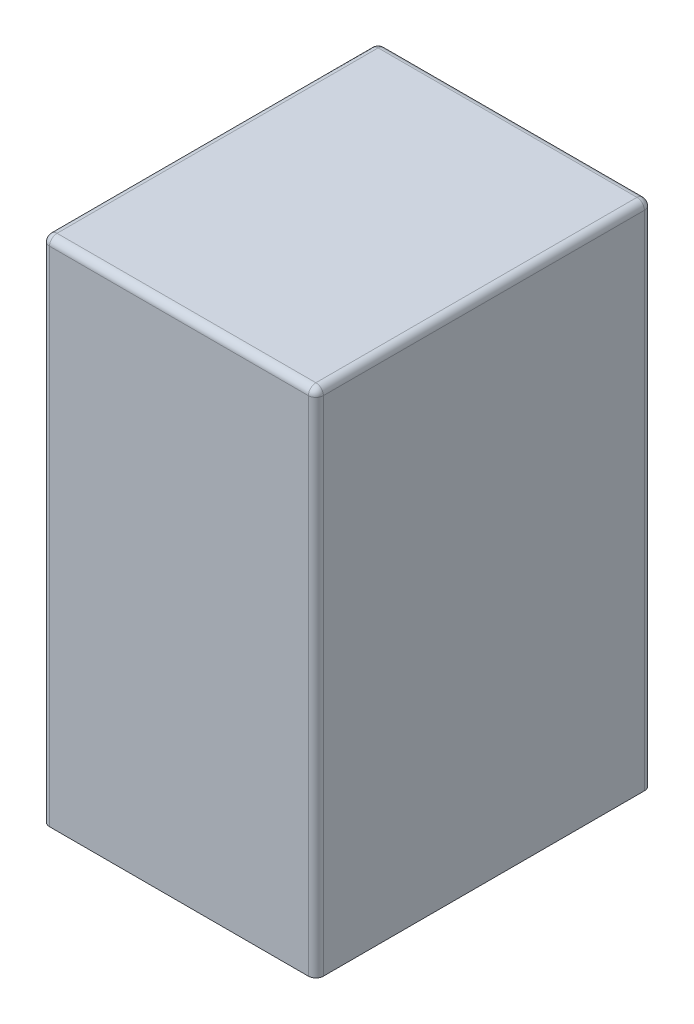
ISO-10303-21;
HEADER;
FILE_DESCRIPTION(('STEP AP214'),'2;1');
FILE_NAME('part.step','',(''),(''),'','','');
FILE_SCHEMA(('AUTOMOTIVE_DESIGN { 1 0 10303 214 1 1 1 1 }'));
ENDSEC;
DATA;
#1=APPLICATION_CONTEXT('core data for automotive mechanical design processes');
#2=APPLICATION_PROTOCOL_DEFINITION('international standard','automotive_design',2000,#1);
#3=PRODUCT_CONTEXT('',#1,'mechanical');
#4=PRODUCT('Part','Part','',(#3));
#5=PRODUCT_RELATED_PRODUCT_CATEGORY('part','',(#4));
#6=PRODUCT_DEFINITION_FORMATION('','',#4);
#7=PRODUCT_DEFINITION_CONTEXT('part definition',#1,'design');
#8=PRODUCT_DEFINITION('design','',#6,#7);
#9=PRODUCT_DEFINITION_SHAPE('','',#8);
#10=(LENGTH_UNIT() NAMED_UNIT(*) SI_UNIT(.MILLI.,.METRE.));
#11=(NAMED_UNIT(*) PLANE_ANGLE_UNIT() SI_UNIT($,.RADIAN.));
#12=(NAMED_UNIT(*) SI_UNIT($,.STERADIAN.) SOLID_ANGLE_UNIT());
#13=UNCERTAINTY_MEASURE_WITH_UNIT(LENGTH_MEASURE(1.E-05),#10,'distance_accuracy_value','');
#14=(GEOMETRIC_REPRESENTATION_CONTEXT(3) GLOBAL_UNCERTAINTY_ASSIGNED_CONTEXT((#13)) GLOBAL_UNIT_ASSIGNED_CONTEXT((#10,
#11,#12)) REPRESENTATION_CONTEXT('',''));
#15=CARTESIAN_POINT('',(0.,0.,0.));
#16=DIRECTION('',(0.,0.,1.));
#17=DIRECTION('',(1.,0.,0.));
#18=AXIS2_PLACEMENT_3D('',#15,#16,#17);
#19=CARTESIAN_POINT('',(0.,0.,0.));
#20=DIRECTION('',(0.,1.,0.));
#21=DIRECTION('',(0.,0.,1.));
#22=AXIS2_PLACEMENT_3D('',#19,#20,#21);
#23=PLANE('',#22);
#24=CARTESIAN_POINT('',(-52.5,0.,-65.));
#25=DIRECTION('',(0.,-1.,0.));
#26=DIRECTION('',(0.,0.,-1.));
#27=AXIS2_PLACEMENT_3D('',#24,#25,#26);
#28=CIRCLE('',#27,1.45);
#29=CARTESIAN_POINT('',(-52.5,0.,-66.45));
#30=VERTEX_POINT('',#29);
#31=EDGE_CURVE('E293',#30,#30,#28,.T.);
#32=ORIENTED_EDGE('',*,*,#31,.F.);
#33=EDGE_LOOP('',(#32));
#34=FACE_BOUND('',#33,.T.);
#35=CARTESIAN_POINT('',(-52.5,0.,0.));
#36=DIRECTION('',(0.,-1.,0.));
#37=DIRECTION('',(0.,0.,-1.));
#38=AXIS2_PLACEMENT_3D('',#35,#36,#37);
#39=CIRCLE('',#38,1.45);
#40=CARTESIAN_POINT('',(-52.5,0.,-1.45));
#41=VERTEX_POINT('',#40);
#42=EDGE_CURVE('E303',#41,#41,#39,.T.);
#43=ORIENTED_EDGE('',*,*,#42,.F.);
#44=EDGE_LOOP('',(#43));
#45=FACE_BOUND('',#44,.T.);
#46=CARTESIAN_POINT('',(-52.5,0.,65.));
#47=DIRECTION('',(0.,-1.,0.));
#48=DIRECTION('',(0.,0.,-1.));
#49=AXIS2_PLACEMENT_3D('',#46,#47,#48);
#50=CIRCLE('',#49,1.45);
#51=CARTESIAN_POINT('',(-52.5,0.,63.55));
#52=VERTEX_POINT('',#51);
#53=EDGE_CURVE('E775',#52,#52,#50,.T.);
#54=ORIENTED_EDGE('',*,*,#53,.F.);
#55=EDGE_LOOP('',(#54));
#56=FACE_BOUND('',#55,.T.);
#57=CARTESIAN_POINT('',(0.,0.,65.));
#58=DIRECTION('',(0.,-1.,0.));
#59=DIRECTION('',(0.,0.,-1.));
#60=AXIS2_PLACEMENT_3D('',#57,#58,#59);
#61=CIRCLE('',#60,1.45);
#62=CARTESIAN_POINT('',(0.,0.,63.55));
#63=VERTEX_POINT('',#62);
#64=EDGE_CURVE('E787',#63,#63,#61,.T.);
#65=ORIENTED_EDGE('',*,*,#64,.F.);
#66=EDGE_LOOP('',(#65));
#67=FACE_BOUND('',#66,.T.);
#68=CARTESIAN_POINT('',(52.5,0.,65.));
#69=DIRECTION('',(0.,-1.,0.));
#70=DIRECTION('',(0.,0.,-1.));
#71=AXIS2_PLACEMENT_3D('',#68,#69,#70);
#72=CIRCLE('',#71,1.45);
#73=CARTESIAN_POINT('',(52.5,0.,63.55));
#74=VERTEX_POINT('',#73);
#75=EDGE_CURVE('E795',#74,#74,#72,.T.);
#76=ORIENTED_EDGE('',*,*,#75,.F.);
#77=EDGE_LOOP('',(#76));
#78=FACE_BOUND('',#77,.T.);
#79=CARTESIAN_POINT('',(52.5,0.,0.));
#80=DIRECTION('',(0.,-1.,0.));
#81=DIRECTION('',(0.,0.,-1.));
#82=AXIS2_PLACEMENT_3D('',#79,#80,#81);
#83=CIRCLE('',#82,1.45);
#84=CARTESIAN_POINT('',(52.5,0.,-1.44999999999999));
#85=VERTEX_POINT('',#84);
#86=EDGE_CURVE('E803',#85,#85,#83,.T.);
#87=ORIENTED_EDGE('',*,*,#86,.F.);
#88=EDGE_LOOP('',(#87));
#89=FACE_BOUND('',#88,.T.);
#90=CARTESIAN_POINT('',(52.5,0.,-65.));
#91=DIRECTION('',(0.,-1.,0.));
#92=DIRECTION('',(0.,0.,-1.));
#93=AXIS2_PLACEMENT_3D('',#90,#91,#92);
#94=CIRCLE('',#93,1.45);
#95=CARTESIAN_POINT('',(52.5,0.,-66.45));
#96=VERTEX_POINT('',#95);
#97=EDGE_CURVE('E811',#96,#96,#94,.T.);
#98=ORIENTED_EDGE('',*,*,#97,.F.);
#99=EDGE_LOOP('',(#98));
#100=FACE_BOUND('',#99,.T.);
#101=CARTESIAN_POINT('',(0.,0.,-65.));
#102=DIRECTION('',(0.,-1.,0.));
#103=DIRECTION('',(0.,0.,-1.));
#104=AXIS2_PLACEMENT_3D('',#101,#102,#103);
#105=CIRCLE('',#104,1.45);
#106=CARTESIAN_POINT('',(0.,0.,-66.45));
#107=VERTEX_POINT('',#106);
#108=EDGE_CURVE('E312',#107,#107,#105,.T.);
#109=ORIENTED_EDGE('',*,*,#108,.F.);
#110=EDGE_LOOP('',(#109));
#111=FACE_BOUND('',#110,.T.);
#112=DIRECTION('',(0.,0.,1.));
#113=VECTOR('',#112,1.);
#114=CARTESIAN_POINT('',(-55.,0.,-67.5));
#115=LINE('',#114,#113);
#116=CARTESIAN_POINT('',(-55.,0.,-64.5));
#117=VERTEX_POINT('',#116);
#118=CARTESIAN_POINT('',(-55.,0.,64.5));
#119=VERTEX_POINT('',#118);
#120=EDGE_CURVE('E172',#117,#119,#115,.T.);
#121=ORIENTED_EDGE('',*,*,#120,.F.);
#122=CARTESIAN_POINT('',(-52.,0.,-64.5));
#123=DIRECTION('',(0.,1.,0.));
#124=DIRECTION('',(0.,0.,1.));
#125=AXIS2_PLACEMENT_3D('',#122,#123,#124);
#126=CIRCLE('',#125,3.);
#127=CARTESIAN_POINT('',(-52.,0.,-67.5));
#128=VERTEX_POINT('',#127);
#129=EDGE_CURVE('E11',#117,#128,#126,.F.);
#130=ORIENTED_EDGE('',*,*,#129,.T.);
#131=DIRECTION('',(-1.,0.,0.));
#132=VECTOR('',#131,1.);
#133=CARTESIAN_POINT('',(-55.,0.,-67.5));
#134=LINE('',#133,#132);
#135=CARTESIAN_POINT('',(52.,0.,-67.5));
#136=VERTEX_POINT('',#135);
#137=EDGE_CURVE('E189',#136,#128,#134,.T.);
#138=ORIENTED_EDGE('',*,*,#137,.F.);
#139=CARTESIAN_POINT('',(52.,0.,-64.5));
#140=DIRECTION('',(0.,1.,0.));
#141=DIRECTION('',(0.,0.,1.));
#142=AXIS2_PLACEMENT_3D('',#139,#140,#141);
#143=CIRCLE('',#142,3.);
#144=CARTESIAN_POINT('',(55.,0.,-64.5));
#145=VERTEX_POINT('',#144);
#146=EDGE_CURVE('E240',#136,#145,#143,.F.);
#147=ORIENTED_EDGE('',*,*,#146,.T.);
#148=DIRECTION('',(0.,0.,-1.));
#149=VECTOR('',#148,1.);
#150=CARTESIAN_POINT('',(55.,0.,-67.5));
#151=LINE('',#150,#149);
#152=CARTESIAN_POINT('',(55.,0.,64.5));
#153=VERTEX_POINT('',#152);
#154=EDGE_CURVE('E185',#153,#145,#151,.T.);
#155=ORIENTED_EDGE('',*,*,#154,.F.);
#156=CARTESIAN_POINT('',(52.,0.,64.5));
#157=DIRECTION('',(0.,1.,0.));
#158=DIRECTION('',(0.,0.,1.));
#159=AXIS2_PLACEMENT_3D('',#156,#157,#158);
#160=CIRCLE('',#159,3.);
#161=CARTESIAN_POINT('',(52.,0.,67.5));
#162=VERTEX_POINT('',#161);
#163=EDGE_CURVE('E243',#153,#162,#160,.F.);
#164=ORIENTED_EDGE('',*,*,#163,.T.);
#165=DIRECTION('',(1.,0.,0.));
#166=VECTOR('',#165,1.);
#167=CARTESIAN_POINT('',(-55.,0.,67.5));
#168=LINE('',#167,#166);
#169=CARTESIAN_POINT('',(-52.,0.,67.5));
#170=VERTEX_POINT('',#169);
#171=EDGE_CURVE('E181',#170,#162,#168,.T.);
#172=ORIENTED_EDGE('',*,*,#171,.F.);
#173=CARTESIAN_POINT('',(-52.,0.,64.5));
#174=DIRECTION('',(0.,1.,0.));
#175=DIRECTION('',(0.,0.,1.));
#176=AXIS2_PLACEMENT_3D('',#173,#174,#175);
#177=CIRCLE('',#176,3.);
#178=EDGE_CURVE('E49',#170,#119,#177,.F.);
#179=ORIENTED_EDGE('',*,*,#178,.T.);
#180=EDGE_LOOP('',(#121,#130,#138,#147,#155,#164,#172,#179));
#181=FACE_BOUND('',#180,.T.);
#182=DIRECTION('',(0.,0.,-1.));
#183=VECTOR('',#182,1.);
#184=CARTESIAN_POINT('',(50.,0.,-62.5));
#185=LINE('',#184,#183);
#186=CARTESIAN_POINT('',(50.,0.,62.5));
#187=VERTEX_POINT('',#186);
#188=CARTESIAN_POINT('',(50.,0.,-62.5));
#189=VERTEX_POINT('',#188);
#190=EDGE_CURVE('E311',#187,#189,#185,.T.);
#191=ORIENTED_EDGE('',*,*,#190,.T.);
#192=DIRECTION('',(-1.,0.,0.));
#193=VECTOR('',#192,1.);
#194=CARTESIAN_POINT('',(-50.,0.,-62.5));
#195=LINE('',#194,#193);
#196=CARTESIAN_POINT('',(-50.,0.,-62.5));
#197=VERTEX_POINT('',#196);
#198=EDGE_CURVE('E325',#189,#197,#195,.T.);
#199=ORIENTED_EDGE('',*,*,#198,.T.);
#200=DIRECTION('',(0.,0.,1.));
#201=VECTOR('',#200,1.);
#202=CARTESIAN_POINT('',(-50.,0.,-62.5));
#203=LINE('',#202,#201);
#204=CARTESIAN_POINT('',(-50.,0.,62.5));
#205=VERTEX_POINT('',#204);
#206=EDGE_CURVE('E165',#197,#205,#203,.T.);
#207=ORIENTED_EDGE('',*,*,#206,.T.);
#208=DIRECTION('',(1.,0.,0.));
#209=VECTOR('',#208,1.);
#210=CARTESIAN_POINT('',(-50.,0.,62.5));
#211=LINE('',#210,#209);
#212=EDGE_CURVE('E318',#205,#187,#211,.T.);
#213=ORIENTED_EDGE('',*,*,#212,.T.);
#214=EDGE_LOOP('',(#191,#199,#207,#213));
#215=FACE_BOUND('',#214,.T.);
#216=ADVANCED_FACE('F39',(#34,#45,#56,#67,#78,#89,#100,#111,#181,#215),#23,.F.);
#217=CARTESIAN_POINT('',(-55.,200.,-67.5));
#218=DIRECTION('',(1.,0.,0.));
#219=DIRECTION('',(0.,0.,-1.));
#220=AXIS2_PLACEMENT_3D('',#217,#218,#219);
#221=PLANE('',#220);
#222=DIRECTION('',(0.,0.,1.));
#223=VECTOR('',#222,1.);
#224=CARTESIAN_POINT('',(-55.,202.,-67.5));
#225=LINE('',#224,#223);
#226=CARTESIAN_POINT('',(-55.,202.,64.5));
#227=VERTEX_POINT('',#226);
#228=CARTESIAN_POINT('',(-55.,202.,-64.5));
#229=VERTEX_POINT('',#228);
#230=EDGE_CURVE('E227',#227,#229,#225,.F.);
#231=ORIENTED_EDGE('',*,*,#230,.T.);
#232=DIRECTION('',(0.,-1.,0.));
#233=VECTOR('',#232,1.);
#234=CARTESIAN_POINT('',(-55.,200.,-64.5));
#235=LINE('',#234,#233);
#236=EDGE_CURVE('E230',#229,#117,#235,.T.);
#237=ORIENTED_EDGE('',*,*,#236,.T.);
#238=ORIENTED_EDGE('',*,*,#120,.T.);
#239=DIRECTION('',(0.,-1.,0.));
#240=VECTOR('',#239,1.);
#241=CARTESIAN_POINT('',(-55.,200.,64.5));
#242=LINE('',#241,#240);
#243=EDGE_CURVE('E224',#119,#227,#242,.F.);
#244=ORIENTED_EDGE('',*,*,#243,.T.);
#245=EDGE_LOOP('',(#231,#237,#238,#244));
#246=FACE_BOUND('',#245,.T.);
#247=ADVANCED_FACE('F353',(#246),#221,.F.);
#248=CARTESIAN_POINT('',(-55.,200.,67.5));
#249=DIRECTION('',(0.,0.,-1.));
#250=DIRECTION('',(-1.,0.,0.));
#251=AXIS2_PLACEMENT_3D('',#248,#249,#250);
#252=PLANE('',#251);
#253=DIRECTION('',(1.,0.,0.));
#254=VECTOR('',#253,1.);
#255=CARTESIAN_POINT('',(-55.,202.,67.5));
#256=LINE('',#255,#254);
#257=CARTESIAN_POINT('',(52.,202.,67.5));
#258=VERTEX_POINT('',#257);
#259=CARTESIAN_POINT('',(-52.,202.,67.5));
#260=VERTEX_POINT('',#259);
#261=EDGE_CURVE('E218',#258,#260,#256,.F.);
#262=ORIENTED_EDGE('',*,*,#261,.T.);
#263=DIRECTION('',(0.,-1.,0.));
#264=VECTOR('',#263,1.);
#265=CARTESIAN_POINT('',(-52.,200.,67.5));
#266=LINE('',#265,#264);
#267=EDGE_CURVE('E221',#260,#170,#266,.T.);
#268=ORIENTED_EDGE('',*,*,#267,.T.);
#269=ORIENTED_EDGE('',*,*,#171,.T.);
#270=DIRECTION('',(0.,-1.,0.));
#271=VECTOR('',#270,1.);
#272=CARTESIAN_POINT('',(52.,200.,67.5));
#273=LINE('',#272,#271);
#274=EDGE_CURVE('E215',#162,#258,#273,.F.);
#275=ORIENTED_EDGE('',*,*,#274,.T.);
#276=EDGE_LOOP('',(#262,#268,#269,#275));
#277=FACE_BOUND('',#276,.T.);
#278=ADVANCED_FACE('F358',(#277),#252,.F.);
#279=CARTESIAN_POINT('',(55.,200.,-67.5));
#280=DIRECTION('',(-1.,0.,0.));
#281=DIRECTION('',(0.,0.,1.));
#282=AXIS2_PLACEMENT_3D('',#279,#280,#281);
#283=PLANE('',#282);
#284=DIRECTION('',(0.,0.,-1.));
#285=VECTOR('',#284,1.);
#286=CARTESIAN_POINT('',(55.,202.,67.5));
#287=LINE('',#286,#285);
#288=CARTESIAN_POINT('',(55.,202.,-64.5));
#289=VERTEX_POINT('',#288);
#290=CARTESIAN_POINT('',(55.,202.,64.5));
#291=VERTEX_POINT('',#290);
#292=EDGE_CURVE('E208',#289,#291,#287,.F.);
#293=ORIENTED_EDGE('',*,*,#292,.T.);
#294=DIRECTION('',(0.,-1.,0.));
#295=VECTOR('',#294,1.);
#296=CARTESIAN_POINT('',(55.,200.,64.5));
#297=LINE('',#296,#295);
#298=EDGE_CURVE('E212',#291,#153,#297,.T.);
#299=ORIENTED_EDGE('',*,*,#298,.T.);
#300=ORIENTED_EDGE('',*,*,#154,.T.);
#301=DIRECTION('',(0.,-1.,0.));
#302=VECTOR('',#301,1.);
#303=CARTESIAN_POINT('',(55.,200.,-64.5));
#304=LINE('',#303,#302);
#305=EDGE_CURVE('E205',#145,#289,#304,.F.);
#306=ORIENTED_EDGE('',*,*,#305,.T.);
#307=EDGE_LOOP('',(#293,#299,#300,#306));
#308=FACE_BOUND('',#307,.T.);
#309=ADVANCED_FACE('F349',(#308),#283,.F.);
#310=CARTESIAN_POINT('',(-55.,200.,-67.5));
#311=DIRECTION('',(0.,0.,1.));
#312=DIRECTION('',(1.,0.,0.));
#313=AXIS2_PLACEMENT_3D('',#310,#311,#312);
#314=PLANE('',#313);
#315=ORIENTED_EDGE('',*,*,#137,.T.);
#316=DIRECTION('',(0.,-1.,0.));
#317=VECTOR('',#316,1.);
#318=CARTESIAN_POINT('',(-52.,200.,-67.5));
#319=LINE('',#318,#317);
#320=CARTESIAN_POINT('',(-52.,202.,-67.5));
#321=VERTEX_POINT('',#320);
#322=EDGE_CURVE('E57',#128,#321,#319,.F.);
#323=ORIENTED_EDGE('',*,*,#322,.T.);
#324=DIRECTION('',(-1.,0.,0.));
#325=VECTOR('',#324,1.);
#326=CARTESIAN_POINT('',(55.,202.,-67.5));
#327=LINE('',#326,#325);
#328=CARTESIAN_POINT('',(52.,202.,-67.5));
#329=VERTEX_POINT('',#328);
#330=EDGE_CURVE('E62',#321,#329,#327,.F.);
#331=ORIENTED_EDGE('',*,*,#330,.T.);
#332=DIRECTION('',(0.,-1.,0.));
#333=VECTOR('',#332,1.);
#334=CARTESIAN_POINT('',(52.,200.,-67.5));
#335=LINE('',#334,#333);
#336=EDGE_CURVE('E233',#329,#136,#335,.T.);
#337=ORIENTED_EDGE('',*,*,#336,.T.);
#338=EDGE_LOOP('',(#315,#323,#331,#337));
#339=FACE_BOUND('',#338,.T.);
#340=ADVANCED_FACE('F342',(#339),#314,.F.);
#341=CARTESIAN_POINT('',(50.,200.,-62.5));
#342=DIRECTION('',(-1.,0.,0.));
#343=DIRECTION('',(0.,0.,1.));
#344=AXIS2_PLACEMENT_3D('',#341,#342,#343);
#345=PLANE('',#344);
#346=ORIENTED_EDGE('',*,*,#190,.F.);
#347=DIRECTION('',(0.,-1.,0.));
#348=VECTOR('',#347,1.);
#349=CARTESIAN_POINT('',(50.,200.,62.5));
#350=LINE('',#349,#348);
#351=CARTESIAN_POINT('',(50.,200.,62.5));
#352=VERTEX_POINT('',#351);
#353=EDGE_CURVE('E174',#352,#187,#350,.T.);
#354=ORIENTED_EDGE('',*,*,#353,.F.);
#355=DIRECTION('',(0.,0.,-1.));
#356=VECTOR('',#355,1.);
#357=CARTESIAN_POINT('',(50.,200.,-62.5));
#358=LINE('',#357,#356);
#359=CARTESIAN_POINT('',(50.,200.,-62.5));
#360=VERTEX_POINT('',#359);
#361=EDGE_CURVE('E161',#352,#360,#358,.T.);
#362=ORIENTED_EDGE('',*,*,#361,.T.);
#363=DIRECTION('',(0.,-1.,0.));
#364=VECTOR('',#363,1.);
#365=CARTESIAN_POINT('',(50.,200.,-62.5));
#366=LINE('',#365,#364);
#367=EDGE_CURVE('E159',#360,#189,#366,.T.);
#368=ORIENTED_EDGE('',*,*,#367,.T.);
#369=EDGE_LOOP('',(#346,#354,#362,#368));
#370=FACE_BOUND('',#369,.T.);
#371=ADVANCED_FACE('F340',(#370),#345,.T.);
#372=CARTESIAN_POINT('',(-50.,200.,-62.5));
#373=DIRECTION('',(0.,0.,1.));
#374=DIRECTION('',(1.,0.,0.));
#375=AXIS2_PLACEMENT_3D('',#372,#373,#374);
#376=PLANE('',#375);
#377=ORIENTED_EDGE('',*,*,#198,.F.);
#378=ORIENTED_EDGE('',*,*,#367,.F.);
#379=DIRECTION('',(-1.,0.,0.));
#380=VECTOR('',#379,1.);
#381=CARTESIAN_POINT('',(-50.,200.,-62.5));
#382=LINE('',#381,#380);
#383=CARTESIAN_POINT('',(-50.,200.,-62.5));
#384=VERTEX_POINT('',#383);
#385=EDGE_CURVE('E144',#360,#384,#382,.T.);
#386=ORIENTED_EDGE('',*,*,#385,.T.);
#387=DIRECTION('',(0.,-1.,0.));
#388=VECTOR('',#387,1.);
#389=CARTESIAN_POINT('',(-50.,200.,-62.5));
#390=LINE('',#389,#388);
#391=EDGE_CURVE('E156',#384,#197,#390,.T.);
#392=ORIENTED_EDGE('',*,*,#391,.T.);
#393=EDGE_LOOP('',(#377,#378,#386,#392));
#394=FACE_BOUND('',#393,.T.);
#395=ADVANCED_FACE('F155',(#394),#376,.T.);
#396=CARTESIAN_POINT('',(-50.,200.,-62.5));
#397=DIRECTION('',(1.,0.,0.));
#398=DIRECTION('',(0.,0.,-1.));
#399=AXIS2_PLACEMENT_3D('',#396,#397,#398);
#400=PLANE('',#399);
#401=ORIENTED_EDGE('',*,*,#206,.F.);
#402=ORIENTED_EDGE('',*,*,#391,.F.);
#403=DIRECTION('',(0.,0.,1.));
#404=VECTOR('',#403,1.);
#405=CARTESIAN_POINT('',(-50.,200.,-62.5));
#406=LINE('',#405,#404);
#407=CARTESIAN_POINT('',(-50.,200.,62.5));
#408=VERTEX_POINT('',#407);
#409=EDGE_CURVE('E141',#384,#408,#406,.T.);
#410=ORIENTED_EDGE('',*,*,#409,.T.);
#411=DIRECTION('',(0.,-1.,0.));
#412=VECTOR('',#411,1.);
#413=CARTESIAN_POINT('',(-50.,200.,62.5));
#414=LINE('',#413,#412);
#415=EDGE_CURVE('E168',#408,#205,#414,.T.);
#416=ORIENTED_EDGE('',*,*,#415,.T.);
#417=EDGE_LOOP('',(#401,#402,#410,#416));
#418=FACE_BOUND('',#417,.T.);
#419=ADVANCED_FACE('F163',(#418),#400,.T.);
#420=CARTESIAN_POINT('',(-50.,200.,62.5));
#421=DIRECTION('',(0.,0.,-1.));
#422=DIRECTION('',(-1.,0.,0.));
#423=AXIS2_PLACEMENT_3D('',#420,#421,#422);
#424=PLANE('',#423);
#425=ORIENTED_EDGE('',*,*,#212,.F.);
#426=ORIENTED_EDGE('',*,*,#415,.F.);
#427=DIRECTION('',(1.,0.,0.));
#428=VECTOR('',#427,1.);
#429=CARTESIAN_POINT('',(-50.,200.,62.5));
#430=LINE('',#429,#428);
#431=EDGE_CURVE('E147',#408,#352,#430,.T.);
#432=ORIENTED_EDGE('',*,*,#431,.T.);
#433=ORIENTED_EDGE('',*,*,#353,.T.);
#434=EDGE_LOOP('',(#425,#426,#432,#433));
#435=FACE_BOUND('',#434,.T.);
#436=ADVANCED_FACE('F337',(#435),#424,.T.);
#437=CARTESIAN_POINT('',(0.,200.,0.));
#438=DIRECTION('',(0.,1.,0.));
#439=DIRECTION('',(0.,0.,1.));
#440=AXIS2_PLACEMENT_3D('',#437,#438,#439);
#441=PLANE('',#440);
#442=ORIENTED_EDGE('',*,*,#385,.F.);
#443=ORIENTED_EDGE('',*,*,#361,.F.);
#444=ORIENTED_EDGE('',*,*,#431,.F.);
#445=ORIENTED_EDGE('',*,*,#409,.F.);
#446=EDGE_LOOP('',(#442,#443,#444,#445));
#447=FACE_BOUND('',#446,.T.);
#448=ADVANCED_FACE('F143',(#447),#441,.F.);
#449=CARTESIAN_POINT('',(0.,205.,0.));
#450=DIRECTION('',(0.,1.,0.));
#451=DIRECTION('',(0.,0.,1.));
#452=AXIS2_PLACEMENT_3D('',#449,#450,#451);
#453=PLANE('',#452);
#454=DIRECTION('',(1.,0.,0.));
#455=VECTOR('',#454,1.);
#456=CARTESIAN_POINT('',(55.,205.,64.5));
#457=LINE('',#456,#455);
#458=CARTESIAN_POINT('',(-52.,205.,64.5));
#459=VERTEX_POINT('',#458);
#460=CARTESIAN_POINT('',(52.,205.,64.5));
#461=VERTEX_POINT('',#460);
#462=EDGE_CURVE('E198',#459,#461,#457,.T.);
#463=ORIENTED_EDGE('',*,*,#462,.T.);
#464=DIRECTION('',(0.,0.,-1.));
#465=VECTOR('',#464,1.);
#466=CARTESIAN_POINT('',(52.,205.,-67.5));
#467=LINE('',#466,#465);
#468=CARTESIAN_POINT('',(52.,205.,-64.5));
#469=VERTEX_POINT('',#468);
#470=EDGE_CURVE('E201',#461,#469,#467,.T.);
#471=ORIENTED_EDGE('',*,*,#470,.T.);
#472=DIRECTION('',(-1.,0.,0.));
#473=VECTOR('',#472,1.);
#474=CARTESIAN_POINT('',(-55.,205.,-64.5));
#475=LINE('',#474,#473);
#476=CARTESIAN_POINT('',(-52.,205.,-64.5));
#477=VERTEX_POINT('',#476);
#478=EDGE_CURVE('E192',#469,#477,#475,.T.);
#479=ORIENTED_EDGE('',*,*,#478,.T.);
#480=DIRECTION('',(0.,0.,1.));
#481=VECTOR('',#480,1.);
#482=CARTESIAN_POINT('',(-52.,205.,67.5));
#483=LINE('',#482,#481);
#484=EDGE_CURVE('E195',#477,#459,#483,.T.);
#485=ORIENTED_EDGE('',*,*,#484,.T.);
#486=EDGE_LOOP('',(#463,#471,#479,#485));
#487=FACE_BOUND('',#486,.T.);
#488=ADVANCED_FACE('F440',(#487),#453,.T.);
#489=CARTESIAN_POINT('',(0.,12.,-65.));
#490=DIRECTION('',(0.,-1.,0.));
#491=DIRECTION('',(0.,0.,-1.));
#492=AXIS2_PLACEMENT_3D('',#489,#490,#491);
#493=CYLINDRICAL_SURFACE('',#492,1.45);
#494=CARTESIAN_POINT('',(0.,12.,-65.));
#495=DIRECTION('',(0.,-1.,0.));
#496=DIRECTION('',(0.,0.,-1.));
#497=AXIS2_PLACEMENT_3D('',#494,#495,#496);
#498=CIRCLE('',#497,1.45);
#499=CARTESIAN_POINT('',(0.,12.,-66.45));
#500=VERTEX_POINT('',#499);
#501=EDGE_CURVE('E307',#500,#500,#498,.T.);
#502=ORIENTED_EDGE('',*,*,#501,.F.);
#503=EDGE_LOOP('',(#502));
#504=FACE_BOUND('',#503,.T.);
#505=ORIENTED_EDGE('',*,*,#108,.T.);
#506=EDGE_LOOP('',(#505));
#507=FACE_BOUND('',#506,.T.);
#508=ADVANCED_FACE('F448',(#504,#507),#493,.F.);
#509=CARTESIAN_POINT('',(0.,12.,0.));
#510=DIRECTION('',(0.,-1.,0.));
#511=DIRECTION('',(0.,0.,-1.));
#512=AXIS2_PLACEMENT_3D('',#509,#510,#511);
#513=PLANE('',#512);
#514=ORIENTED_EDGE('',*,*,#501,.T.);
#515=EDGE_LOOP('',(#514));
#516=FACE_BOUND('',#515,.T.);
#517=ADVANCED_FACE('F454',(#516),#513,.T.);
#518=CARTESIAN_POINT('',(52.5,12.,-65.));
#519=DIRECTION('',(0.,-1.,0.));
#520=DIRECTION('',(0.,0.,-1.));
#521=AXIS2_PLACEMENT_3D('',#518,#519,#520);
#522=CYLINDRICAL_SURFACE('',#521,1.45);
#523=CARTESIAN_POINT('',(52.5,12.,-65.));
#524=DIRECTION('',(0.,-1.,0.));
#525=DIRECTION('',(0.,0.,-1.));
#526=AXIS2_PLACEMENT_3D('',#523,#524,#525);
#527=CIRCLE('',#526,1.45);
#528=CARTESIAN_POINT('',(52.5,12.,-66.45));
#529=VERTEX_POINT('',#528);
#530=EDGE_CURVE('E316',#529,#529,#527,.T.);
#531=ORIENTED_EDGE('',*,*,#530,.F.);
#532=EDGE_LOOP('',(#531));
#533=FACE_BOUND('',#532,.T.);
#534=ORIENTED_EDGE('',*,*,#97,.T.);
#535=EDGE_LOOP('',(#534));
#536=FACE_BOUND('',#535,.T.);
#537=ADVANCED_FACE('F493',(#533,#536),#522,.F.);
#538=CARTESIAN_POINT('',(0.,12.,0.));
#539=DIRECTION('',(0.,-1.,0.));
#540=DIRECTION('',(0.,0.,-1.));
#541=AXIS2_PLACEMENT_3D('',#538,#539,#540);
#542=PLANE('',#541);
#543=ORIENTED_EDGE('',*,*,#530,.T.);
#544=EDGE_LOOP('',(#543));
#545=FACE_BOUND('',#544,.T.);
#546=ADVANCED_FACE('F502',(#545),#542,.T.);
#547=CARTESIAN_POINT('',(52.5,12.,0.));
#548=DIRECTION('',(0.,-1.,0.));
#549=DIRECTION('',(0.,0.,-1.));
#550=AXIS2_PLACEMENT_3D('',#547,#548,#549);
#551=CYLINDRICAL_SURFACE('',#550,1.45);
#552=CARTESIAN_POINT('',(52.5,12.,0.));
#553=DIRECTION('',(0.,-1.,0.));
#554=DIRECTION('',(0.,0.,-1.));
#555=AXIS2_PLACEMENT_3D('',#552,#553,#554);
#556=CIRCLE('',#555,1.45);
#557=CARTESIAN_POINT('',(52.5,12.,-1.44999999999999));
#558=VERTEX_POINT('',#557);
#559=EDGE_CURVE('E807',#558,#558,#556,.T.);
#560=ORIENTED_EDGE('',*,*,#559,.F.);
#561=EDGE_LOOP('',(#560));
#562=FACE_BOUND('',#561,.T.);
#563=ORIENTED_EDGE('',*,*,#86,.T.);
#564=EDGE_LOOP('',(#563));
#565=FACE_BOUND('',#564,.T.);
#566=ADVANCED_FACE('F513',(#562,#565),#551,.F.);
#567=CARTESIAN_POINT('',(0.,12.,0.));
#568=DIRECTION('',(0.,-1.,0.));
#569=DIRECTION('',(0.,0.,-1.));
#570=AXIS2_PLACEMENT_3D('',#567,#568,#569);
#571=PLANE('',#570);
#572=ORIENTED_EDGE('',*,*,#559,.T.);
#573=EDGE_LOOP('',(#572));
#574=FACE_BOUND('',#573,.T.);
#575=ADVANCED_FACE('F523',(#574),#571,.T.);
#576=CARTESIAN_POINT('',(52.5,12.,65.));
#577=DIRECTION('',(0.,-1.,0.));
#578=DIRECTION('',(0.,0.,-1.));
#579=AXIS2_PLACEMENT_3D('',#576,#577,#578);
#580=CYLINDRICAL_SURFACE('',#579,1.45);
#581=CARTESIAN_POINT('',(52.5,12.,65.));
#582=DIRECTION('',(0.,-1.,0.));
#583=DIRECTION('',(0.,0.,-1.));
#584=AXIS2_PLACEMENT_3D('',#581,#582,#583);
#585=CIRCLE('',#584,1.45);
#586=CARTESIAN_POINT('',(52.5,12.,63.55));
#587=VERTEX_POINT('',#586);
#588=EDGE_CURVE('E799',#587,#587,#585,.T.);
#589=ORIENTED_EDGE('',*,*,#588,.F.);
#590=EDGE_LOOP('',(#589));
#591=FACE_BOUND('',#590,.T.);
#592=ORIENTED_EDGE('',*,*,#75,.T.);
#593=EDGE_LOOP('',(#592));
#594=FACE_BOUND('',#593,.T.);
#595=ADVANCED_FACE('F534',(#591,#594),#580,.F.);
#596=CARTESIAN_POINT('',(0.,12.,0.));
#597=DIRECTION('',(0.,-1.,0.));
#598=DIRECTION('',(0.,0.,-1.));
#599=AXIS2_PLACEMENT_3D('',#596,#597,#598);
#600=PLANE('',#599);
#601=ORIENTED_EDGE('',*,*,#588,.T.);
#602=EDGE_LOOP('',(#601));
#603=FACE_BOUND('',#602,.T.);
#604=ADVANCED_FACE('F544',(#603),#600,.T.);
#605=CARTESIAN_POINT('',(0.,12.,65.));
#606=DIRECTION('',(0.,-1.,0.));
#607=DIRECTION('',(0.,0.,-1.));
#608=AXIS2_PLACEMENT_3D('',#605,#606,#607);
#609=CYLINDRICAL_SURFACE('',#608,1.45);
#610=CARTESIAN_POINT('',(0.,12.,65.));
#611=DIRECTION('',(0.,-1.,0.));
#612=DIRECTION('',(0.,0.,-1.));
#613=AXIS2_PLACEMENT_3D('',#610,#611,#612);
#614=CIRCLE('',#613,1.45);
#615=CARTESIAN_POINT('',(0.,12.,63.55));
#616=VERTEX_POINT('',#615);
#617=EDGE_CURVE('E791',#616,#616,#614,.T.);
#618=ORIENTED_EDGE('',*,*,#617,.F.);
#619=EDGE_LOOP('',(#618));
#620=FACE_BOUND('',#619,.T.);
#621=ORIENTED_EDGE('',*,*,#64,.T.);
#622=EDGE_LOOP('',(#621));
#623=FACE_BOUND('',#622,.T.);
#624=ADVANCED_FACE('F555',(#620,#623),#609,.F.);
#625=CARTESIAN_POINT('',(0.,12.,0.));
#626=DIRECTION('',(0.,-1.,0.));
#627=DIRECTION('',(0.,0.,-1.));
#628=AXIS2_PLACEMENT_3D('',#625,#626,#627);
#629=PLANE('',#628);
#630=ORIENTED_EDGE('',*,*,#617,.T.);
#631=EDGE_LOOP('',(#630));
#632=FACE_BOUND('',#631,.T.);
#633=ADVANCED_FACE('F565',(#632),#629,.T.);
#634=CARTESIAN_POINT('',(-52.5,12.,65.));
#635=DIRECTION('',(0.,-1.,0.));
#636=DIRECTION('',(0.,0.,-1.));
#637=AXIS2_PLACEMENT_3D('',#634,#635,#636);
#638=CYLINDRICAL_SURFACE('',#637,1.45);
#639=CARTESIAN_POINT('',(-52.5,12.,65.));
#640=DIRECTION('',(0.,-1.,0.));
#641=DIRECTION('',(0.,0.,-1.));
#642=AXIS2_PLACEMENT_3D('',#639,#640,#641);
#643=CIRCLE('',#642,1.45);
#644=CARTESIAN_POINT('',(-52.5,12.,63.55));
#645=VERTEX_POINT('',#644);
#646=EDGE_CURVE('E780',#645,#645,#643,.T.);
#647=ORIENTED_EDGE('',*,*,#646,.F.);
#648=EDGE_LOOP('',(#647));
#649=FACE_BOUND('',#648,.T.);
#650=ORIENTED_EDGE('',*,*,#53,.T.);
#651=EDGE_LOOP('',(#650));
#652=FACE_BOUND('',#651,.T.);
#653=ADVANCED_FACE('F576',(#649,#652),#638,.F.);
#654=CARTESIAN_POINT('',(0.,12.,0.));
#655=DIRECTION('',(0.,-1.,0.));
#656=DIRECTION('',(0.,0.,-1.));
#657=AXIS2_PLACEMENT_3D('',#654,#655,#656);
#658=PLANE('',#657);
#659=ORIENTED_EDGE('',*,*,#646,.T.);
#660=EDGE_LOOP('',(#659));
#661=FACE_BOUND('',#660,.T.);
#662=ADVANCED_FACE('F586',(#661),#658,.T.);
#663=CARTESIAN_POINT('',(-52.5,12.,0.));
#664=DIRECTION('',(0.,-1.,0.));
#665=DIRECTION('',(0.,0.,-1.));
#666=AXIS2_PLACEMENT_3D('',#663,#664,#665);
#667=CYLINDRICAL_SURFACE('',#666,1.45);
#668=CARTESIAN_POINT('',(-52.5,12.,0.));
#669=DIRECTION('',(0.,-1.,0.));
#670=DIRECTION('',(0.,0.,-1.));
#671=AXIS2_PLACEMENT_3D('',#668,#669,#670);
#672=CIRCLE('',#671,1.45);
#673=CARTESIAN_POINT('',(-52.5,12.,-1.45));
#674=VERTEX_POINT('',#673);
#675=EDGE_CURVE('E773',#674,#674,#672,.T.);
#676=ORIENTED_EDGE('',*,*,#675,.F.);
#677=EDGE_LOOP('',(#676));
#678=FACE_BOUND('',#677,.T.);
#679=ORIENTED_EDGE('',*,*,#42,.T.);
#680=EDGE_LOOP('',(#679));
#681=FACE_BOUND('',#680,.T.);
#682=ADVANCED_FACE('F597',(#678,#681),#667,.F.);
#683=CARTESIAN_POINT('',(0.,12.,0.));
#684=DIRECTION('',(0.,-1.,0.));
#685=DIRECTION('',(0.,0.,-1.));
#686=AXIS2_PLACEMENT_3D('',#683,#684,#685);
#687=PLANE('',#686);
#688=ORIENTED_EDGE('',*,*,#675,.T.);
#689=EDGE_LOOP('',(#688));
#690=FACE_BOUND('',#689,.T.);
#691=ADVANCED_FACE('F607',(#690),#687,.T.);
#692=CARTESIAN_POINT('',(-52.5,12.,-65.));
#693=DIRECTION('',(0.,-1.,0.));
#694=DIRECTION('',(0.,0.,-1.));
#695=AXIS2_PLACEMENT_3D('',#692,#693,#694);
#696=CYLINDRICAL_SURFACE('',#695,1.45);
#697=CARTESIAN_POINT('',(-52.5,12.,-65.));
#698=DIRECTION('',(0.,-1.,0.));
#699=DIRECTION('',(0.,0.,-1.));
#700=AXIS2_PLACEMENT_3D('',#697,#698,#699);
#701=CIRCLE('',#700,1.45);
#702=CARTESIAN_POINT('',(-52.5,12.,-66.45));
#703=VERTEX_POINT('',#702);
#704=EDGE_CURVE('E297',#703,#703,#701,.T.);
#705=ORIENTED_EDGE('',*,*,#704,.F.);
#706=EDGE_LOOP('',(#705));
#707=FACE_BOUND('',#706,.T.);
#708=ORIENTED_EDGE('',*,*,#31,.T.);
#709=EDGE_LOOP('',(#708));
#710=FACE_BOUND('',#709,.T.);
#711=ADVANCED_FACE('F618',(#707,#710),#696,.F.);
#712=CARTESIAN_POINT('',(0.,12.,0.));
#713=DIRECTION('',(0.,-1.,0.));
#714=DIRECTION('',(0.,0.,-1.));
#715=AXIS2_PLACEMENT_3D('',#712,#713,#714);
#716=PLANE('',#715);
#717=ORIENTED_EDGE('',*,*,#704,.T.);
#718=EDGE_LOOP('',(#717));
#719=FACE_BOUND('',#718,.T.);
#720=ADVANCED_FACE('F413',(#719),#716,.T.);
#721=CARTESIAN_POINT('',(-52.,200.,64.5));
#722=DIRECTION('',(0.,-1.,0.));
#723=DIRECTION('',(0.,0.,-1.));
#724=AXIS2_PLACEMENT_3D('',#721,#722,#723);
#725=CYLINDRICAL_SURFACE('',#724,3.);
#726=ORIENTED_EDGE('',*,*,#178,.F.);
#727=ORIENTED_EDGE('',*,*,#267,.F.);
#728=CARTESIAN_POINT('',(-52.,202.,64.5));
#729=DIRECTION('',(0.,1.,0.));
#730=DIRECTION('',(0.,0.,1.));
#731=AXIS2_PLACEMENT_3D('',#728,#729,#730);
#732=CIRCLE('',#731,3.);
#733=EDGE_CURVE('E43',#227,#260,#732,.T.);
#734=ORIENTED_EDGE('',*,*,#733,.F.);
#735=ORIENTED_EDGE('',*,*,#243,.F.);
#736=EDGE_LOOP('',(#726,#727,#734,#735));
#737=FACE_BOUND('',#736,.T.);
#738=ADVANCED_FACE('F41',(#737),#725,.T.);
#739=CARTESIAN_POINT('',(-52.,202.,0.));
#740=DIRECTION('',(0.,0.,-1.));
#741=DIRECTION('',(-1.,0.,0.));
#742=AXIS2_PLACEMENT_3D('',#739,#740,#741);
#743=CYLINDRICAL_SURFACE('',#742,3.);
#744=CARTESIAN_POINT('',(-52.,202.,-64.5));
#745=DIRECTION('',(0.,0.,-1.));
#746=DIRECTION('',(-1.,0.,0.));
#747=AXIS2_PLACEMENT_3D('',#744,#745,#746);
#748=CIRCLE('',#747,3.);
#749=EDGE_CURVE('E282',#229,#477,#748,.T.);
#750=ORIENTED_EDGE('',*,*,#749,.F.);
#751=ORIENTED_EDGE('',*,*,#230,.F.);
#752=CARTESIAN_POINT('',(-52.,202.,64.5));
#753=DIRECTION('',(0.,0.,1.));
#754=DIRECTION('',(1.,0.,0.));
#755=AXIS2_PLACEMENT_3D('',#752,#753,#754);
#756=CIRCLE('',#755,3.);
#757=EDGE_CURVE('E285',#459,#227,#756,.T.);
#758=ORIENTED_EDGE('',*,*,#757,.F.);
#759=ORIENTED_EDGE('',*,*,#484,.F.);
#760=EDGE_LOOP('',(#750,#751,#758,#759));
#761=FACE_BOUND('',#760,.T.);
#762=ADVANCED_FACE('F406',(#761),#743,.T.);
#763=CARTESIAN_POINT('',(-52.,200.,-64.5));
#764=DIRECTION('',(0.,-1.,0.));
#765=DIRECTION('',(0.,0.,-1.));
#766=AXIS2_PLACEMENT_3D('',#763,#764,#765);
#767=CYLINDRICAL_SURFACE('',#766,3.);
#768=ORIENTED_EDGE('',*,*,#129,.F.);
#769=ORIENTED_EDGE('',*,*,#236,.F.);
#770=CARTESIAN_POINT('',(-52.,202.,-64.5));
#771=DIRECTION('',(0.,1.,0.));
#772=DIRECTION('',(0.,0.,1.));
#773=AXIS2_PLACEMENT_3D('',#770,#771,#772);
#774=CIRCLE('',#773,3.);
#775=EDGE_CURVE('E278',#321,#229,#774,.T.);
#776=ORIENTED_EDGE('',*,*,#775,.F.);
#777=ORIENTED_EDGE('',*,*,#322,.F.);
#778=EDGE_LOOP('',(#768,#769,#776,#777));
#779=FACE_BOUND('',#778,.T.);
#780=ADVANCED_FACE('F404',(#779),#767,.T.);
#781=CARTESIAN_POINT('',(-52.,202.,64.5));
#782=DIRECTION('',(-1.,0.,0.));
#783=DIRECTION('',(0.,0.,1.));
#784=AXIS2_PLACEMENT_3D('',#781,#782,#783);
#785=SPHERICAL_SURFACE('',#784,3.);
#786=ORIENTED_EDGE('',*,*,#757,.T.);
#787=ORIENTED_EDGE('',*,*,#733,.T.);
#788=CARTESIAN_POINT('',(-52.,202.,64.5));
#789=DIRECTION('',(-1.,0.,0.));
#790=DIRECTION('',(0.,0.,1.));
#791=AXIS2_PLACEMENT_3D('',#788,#789,#790);
#792=CIRCLE('',#791,3.);
#793=EDGE_CURVE('E274',#459,#260,#792,.F.);
#794=ORIENTED_EDGE('',*,*,#793,.F.);
#795=EDGE_LOOP('',(#786,#787,#794));
#796=FACE_BOUND('',#795,.T.);
#797=ADVANCED_FACE('F400',(#796),#785,.T.);
#798=CARTESIAN_POINT('',(-52.,202.,-64.5));
#799=DIRECTION('',(-1.,0.,0.));
#800=DIRECTION('',(0.,0.,1.));
#801=AXIS2_PLACEMENT_3D('',#798,#799,#800);
#802=SPHERICAL_SURFACE('',#801,3.);
#803=ORIENTED_EDGE('',*,*,#775,.T.);
#804=ORIENTED_EDGE('',*,*,#749,.T.);
#805=CARTESIAN_POINT('',(-52.,202.,-64.5));
#806=DIRECTION('',(-1.,0.,0.));
#807=DIRECTION('',(0.,0.,1.));
#808=AXIS2_PLACEMENT_3D('',#805,#806,#807);
#809=CIRCLE('',#808,3.);
#810=EDGE_CURVE('E270',#321,#477,#809,.F.);
#811=ORIENTED_EDGE('',*,*,#810,.F.);
#812=EDGE_LOOP('',(#803,#804,#811));
#813=FACE_BOUND('',#812,.T.);
#814=ADVANCED_FACE('F396',(#813),#802,.T.);
#815=CARTESIAN_POINT('',(52.,200.,64.5));
#816=DIRECTION('',(0.,-1.,0.));
#817=DIRECTION('',(0.,0.,-1.));
#818=AXIS2_PLACEMENT_3D('',#815,#816,#817);
#819=CYLINDRICAL_SURFACE('',#818,3.);
#820=ORIENTED_EDGE('',*,*,#163,.F.);
#821=ORIENTED_EDGE('',*,*,#298,.F.);
#822=CARTESIAN_POINT('',(52.,202.,64.5));
#823=DIRECTION('',(0.,1.,0.));
#824=DIRECTION('',(0.,0.,1.));
#825=AXIS2_PLACEMENT_3D('',#822,#823,#824);
#826=CIRCLE('',#825,3.);
#827=EDGE_CURVE('E266',#258,#291,#826,.T.);
#828=ORIENTED_EDGE('',*,*,#827,.F.);
#829=ORIENTED_EDGE('',*,*,#274,.F.);
#830=EDGE_LOOP('',(#820,#821,#828,#829));
#831=FACE_BOUND('',#830,.T.);
#832=ADVANCED_FACE('F392',(#831),#819,.T.);
#833=CARTESIAN_POINT('',(0.,202.,64.5));
#834=DIRECTION('',(-1.,0.,0.));
#835=DIRECTION('',(0.,0.,1.));
#836=AXIS2_PLACEMENT_3D('',#833,#834,#835);
#837=CYLINDRICAL_SURFACE('',#836,3.);
#838=ORIENTED_EDGE('',*,*,#793,.T.);
#839=ORIENTED_EDGE('',*,*,#261,.F.);
#840=CARTESIAN_POINT('',(52.,202.,64.5));
#841=DIRECTION('',(1.,0.,0.));
#842=DIRECTION('',(0.,0.,-1.));
#843=AXIS2_PLACEMENT_3D('',#840,#841,#842);
#844=CIRCLE('',#843,3.);
#845=EDGE_CURVE('E262',#461,#258,#844,.T.);
#846=ORIENTED_EDGE('',*,*,#845,.F.);
#847=ORIENTED_EDGE('',*,*,#462,.F.);
#848=EDGE_LOOP('',(#838,#839,#846,#847));
#849=FACE_BOUND('',#848,.T.);
#850=ADVANCED_FACE('F388',(#849),#837,.T.);
#851=CARTESIAN_POINT('',(0.,202.,-64.5));
#852=DIRECTION('',(1.,0.,0.));
#853=DIRECTION('',(0.,0.,-1.));
#854=AXIS2_PLACEMENT_3D('',#851,#852,#853);
#855=CYLINDRICAL_SURFACE('',#854,3.);
#856=ORIENTED_EDGE('',*,*,#810,.T.);
#857=ORIENTED_EDGE('',*,*,#478,.F.);
#858=CARTESIAN_POINT('',(52.,202.,-64.5));
#859=DIRECTION('',(1.,0.,0.));
#860=DIRECTION('',(0.,1.,0.));
#861=AXIS2_PLACEMENT_3D('',#858,#859,#860);
#862=CIRCLE('',#861,3.);
#863=EDGE_CURVE('E258',#329,#469,#862,.T.);
#864=ORIENTED_EDGE('',*,*,#863,.F.);
#865=ORIENTED_EDGE('',*,*,#330,.F.);
#866=EDGE_LOOP('',(#856,#857,#864,#865));
#867=FACE_BOUND('',#866,.T.);
#868=ADVANCED_FACE('F384',(#867),#855,.T.);
#869=CARTESIAN_POINT('',(52.,200.,-64.5));
#870=DIRECTION('',(0.,-1.,0.));
#871=DIRECTION('',(0.,0.,-1.));
#872=AXIS2_PLACEMENT_3D('',#869,#870,#871);
#873=CYLINDRICAL_SURFACE('',#872,3.);
#874=ORIENTED_EDGE('',*,*,#146,.F.);
#875=ORIENTED_EDGE('',*,*,#336,.F.);
#876=CARTESIAN_POINT('',(52.,202.,-64.5));
#877=DIRECTION('',(0.,1.,0.));
#878=DIRECTION('',(0.,0.,1.));
#879=AXIS2_PLACEMENT_3D('',#876,#877,#878);
#880=CIRCLE('',#879,3.);
#881=EDGE_CURVE('E254',#289,#329,#880,.T.);
#882=ORIENTED_EDGE('',*,*,#881,.F.);
#883=ORIENTED_EDGE('',*,*,#305,.F.);
#884=EDGE_LOOP('',(#874,#875,#882,#883));
#885=FACE_BOUND('',#884,.T.);
#886=ADVANCED_FACE('F380',(#885),#873,.T.);
#887=CARTESIAN_POINT('',(52.,202.,64.5));
#888=DIRECTION('',(0.,0.,1.));
#889=DIRECTION('',(1.,0.,0.));
#890=AXIS2_PLACEMENT_3D('',#887,#888,#889);
#891=SPHERICAL_SURFACE('',#890,3.);
#892=ORIENTED_EDGE('',*,*,#845,.T.);
#893=ORIENTED_EDGE('',*,*,#827,.T.);
#894=CARTESIAN_POINT('',(52.,202.,64.5));
#895=DIRECTION('',(0.,0.,1.));
#896=DIRECTION('',(1.,0.,0.));
#897=AXIS2_PLACEMENT_3D('',#894,#895,#896);
#898=CIRCLE('',#897,3.);
#899=EDGE_CURVE('E251',#461,#291,#898,.F.);
#900=ORIENTED_EDGE('',*,*,#899,.F.);
#901=EDGE_LOOP('',(#892,#893,#900));
#902=FACE_BOUND('',#901,.T.);
#903=ADVANCED_FACE('F376',(#902),#891,.T.);
#904=CARTESIAN_POINT('',(52.,202.,-64.5));
#905=DIRECTION('',(0.,0.,-1.));
#906=DIRECTION('',(-1.,0.,0.));
#907=AXIS2_PLACEMENT_3D('',#904,#905,#906);
#908=SPHERICAL_SURFACE('',#907,3.);
#909=ORIENTED_EDGE('',*,*,#881,.T.);
#910=ORIENTED_EDGE('',*,*,#863,.T.);
#911=CARTESIAN_POINT('',(52.,202.,-64.5));
#912=DIRECTION('',(0.,0.,-1.));
#913=DIRECTION('',(-1.,0.,0.));
#914=AXIS2_PLACEMENT_3D('',#911,#912,#913);
#915=CIRCLE('',#914,3.);
#916=EDGE_CURVE('E248',#289,#469,#915,.F.);
#917=ORIENTED_EDGE('',*,*,#916,.F.);
#918=EDGE_LOOP('',(#909,#910,#917));
#919=FACE_BOUND('',#918,.T.);
#920=ADVANCED_FACE('F372',(#919),#908,.T.);
#921=CARTESIAN_POINT('',(52.,202.,0.));
#922=DIRECTION('',(0.,0.,1.));
#923=DIRECTION('',(1.,0.,0.));
#924=AXIS2_PLACEMENT_3D('',#921,#922,#923);
#925=CYLINDRICAL_SURFACE('',#924,3.);
#926=ORIENTED_EDGE('',*,*,#899,.T.);
#927=ORIENTED_EDGE('',*,*,#292,.F.);
#928=ORIENTED_EDGE('',*,*,#916,.T.);
#929=ORIENTED_EDGE('',*,*,#470,.F.);
#930=EDGE_LOOP('',(#926,#927,#928,#929));
#931=FACE_BOUND('',#930,.T.);
#932=ADVANCED_FACE('F369',(#931),#925,.T.);
#933=CLOSED_SHELL('',(#216,#247,#278,#309,#340,#371,#395,#419,#436,#448,#488,#508,#517,#537,
#546,#566,#575,#595,#604,#624,#633,#653,#662,#682,#691,#711,#720,#738,#762,#780,#797,#814,#832,
#850,#868,#886,#903,#920,#932));
#934=MANIFOLD_SOLID_BREP('B2',#933);
#935=ADVANCED_BREP_SHAPE_REPRESENTATION('',(#18,#934),#14);
#936=SHAPE_DEFINITION_REPRESENTATION(#9,#935);
ENDSEC;
END-ISO-10303-21;
